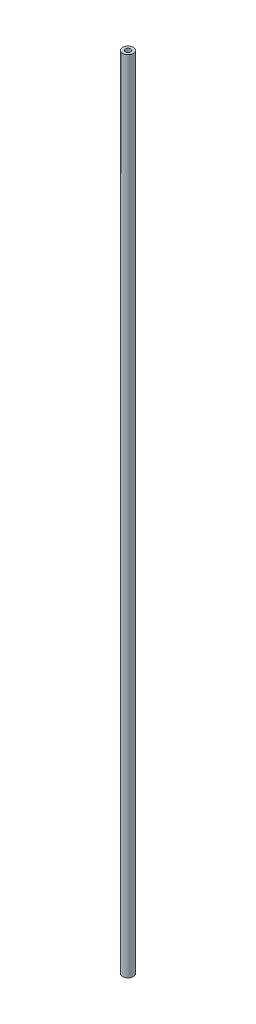
ISO-10303-21;
HEADER;
FILE_DESCRIPTION(('STEP AP214'),'2;1');
FILE_NAME('part.step','',(''),(''),'','','');
FILE_SCHEMA(('AUTOMOTIVE_DESIGN { 1 0 10303 214 1 1 1 1 }'));
ENDSEC;
DATA;
#1=APPLICATION_CONTEXT('core data for automotive mechanical design processes');
#2=APPLICATION_PROTOCOL_DEFINITION('international standard','automotive_design',2000,#1);
#3=PRODUCT_CONTEXT('',#1,'mechanical');
#4=PRODUCT('Part','Part','',(#3));
#5=PRODUCT_RELATED_PRODUCT_CATEGORY('part','',(#4));
#6=PRODUCT_DEFINITION_FORMATION('','',#4);
#7=PRODUCT_DEFINITION_CONTEXT('part definition',#1,'design');
#8=PRODUCT_DEFINITION('design','',#6,#7);
#9=PRODUCT_DEFINITION_SHAPE('','',#8);
#10=(LENGTH_UNIT() NAMED_UNIT(*) SI_UNIT(.MILLI.,.METRE.));
#11=(NAMED_UNIT(*) PLANE_ANGLE_UNIT() SI_UNIT($,.RADIAN.));
#12=(NAMED_UNIT(*) SI_UNIT($,.STERADIAN.) SOLID_ANGLE_UNIT());
#13=UNCERTAINTY_MEASURE_WITH_UNIT(LENGTH_MEASURE(1.E-05),#10,'distance_accuracy_value','');
#14=(GEOMETRIC_REPRESENTATION_CONTEXT(3) GLOBAL_UNCERTAINTY_ASSIGNED_CONTEXT((#13)) GLOBAL_UNIT_ASSIGNED_CONTEXT((#10,
#11,#12)) REPRESENTATION_CONTEXT('',''));
#15=CARTESIAN_POINT('',(0.,0.,0.));
#16=DIRECTION('',(0.,0.,1.));
#17=DIRECTION('',(1.,0.,0.));
#18=AXIS2_PLACEMENT_3D('',#15,#16,#17);
#19=CARTESIAN_POINT('',(0.,150.,0.));
#20=DIRECTION('',(0.,1.,0.));
#21=DIRECTION('',(0.,0.,1.));
#22=AXIS2_PLACEMENT_3D('',#19,#20,#21);
#23=PLANE('',#22);
#24=CARTESIAN_POINT('',(0.,150.,0.));
#25=DIRECTION('',(0.,1.,0.));
#26=DIRECTION('',(0.,0.,1.));
#27=AXIS2_PLACEMENT_3D('',#24,#25,#26);
#28=CIRCLE('',#27,1.);
#29=CARTESIAN_POINT('',(0.,150.,1.));
#30=VERTEX_POINT('',#29);
#31=EDGE_CURVE('E10',#30,#30,#28,.T.);
#32=ORIENTED_EDGE('',*,*,#31,.T.);
#33=EDGE_LOOP('',(#32));
#34=FACE_BOUND('',#33,.T.);
#35=CARTESIAN_POINT('',(0.,150.,0.));
#36=DIRECTION('',(0.,1.,0.));
#37=DIRECTION('',(0.,0.,1.));
#38=AXIS2_PLACEMENT_3D('',#35,#36,#37);
#39=CIRCLE('',#38,0.5);
#40=CARTESIAN_POINT('',(0.,150.,0.5));
#41=VERTEX_POINT('',#40);
#42=EDGE_CURVE('E56',#41,#41,#39,.T.);
#43=ORIENTED_EDGE('',*,*,#42,.F.);
#44=EDGE_LOOP('',(#43));
#45=FACE_BOUND('',#44,.T.);
#46=ADVANCED_FACE('F43',(#34,#45),#23,.T.);
#47=CARTESIAN_POINT('',(0.,0.,0.));
#48=DIRECTION('',(0.,1.,0.));
#49=DIRECTION('',(0.,0.,1.));
#50=AXIS2_PLACEMENT_3D('',#47,#48,#49);
#51=PLANE('',#50);
#52=CARTESIAN_POINT('',(0.,0.,0.));
#53=DIRECTION('',(0.,1.,0.));
#54=DIRECTION('',(0.,0.,1.));
#55=AXIS2_PLACEMENT_3D('',#52,#53,#54);
#56=CIRCLE('',#55,1.);
#57=CARTESIAN_POINT('',(0.,0.,1.));
#58=VERTEX_POINT('',#57);
#59=EDGE_CURVE('E47',#58,#58,#56,.T.);
#60=ORIENTED_EDGE('',*,*,#59,.F.);
#61=EDGE_LOOP('',(#60));
#62=FACE_BOUND('',#61,.T.);
#63=CARTESIAN_POINT('',(0.,0.,0.));
#64=DIRECTION('',(0.,1.,0.));
#65=DIRECTION('',(0.,0.,1.));
#66=AXIS2_PLACEMENT_3D('',#63,#64,#65);
#67=CIRCLE('',#66,0.5);
#68=CARTESIAN_POINT('',(0.,0.,0.5));
#69=VERTEX_POINT('',#68);
#70=EDGE_CURVE('E58',#69,#69,#67,.T.);
#71=ORIENTED_EDGE('',*,*,#70,.T.);
#72=EDGE_LOOP('',(#71));
#73=FACE_BOUND('',#72,.T.);
#74=ADVANCED_FACE('F70',(#62,#73),#51,.F.);
#75=CARTESIAN_POINT('',(0.,150.,0.));
#76=DIRECTION('',(0.,-1.,0.));
#77=DIRECTION('',(0.,0.,-1.));
#78=AXIS2_PLACEMENT_3D('',#75,#76,#77);
#79=CYLINDRICAL_SURFACE('',#78,1.);
#80=ORIENTED_EDGE('',*,*,#31,.F.);
#81=EDGE_LOOP('',(#80));
#82=FACE_BOUND('',#81,.T.);
#83=ORIENTED_EDGE('',*,*,#59,.T.);
#84=EDGE_LOOP('',(#83));
#85=FACE_BOUND('',#84,.T.);
#86=ADVANCED_FACE('F45',(#82,#85),#79,.T.);
#87=CARTESIAN_POINT('',(0.,150.,0.));
#88=DIRECTION('',(0.,-1.,0.));
#89=DIRECTION('',(0.,0.,-1.));
#90=AXIS2_PLACEMENT_3D('',#87,#88,#89);
#91=CYLINDRICAL_SURFACE('',#90,0.5);
#92=ORIENTED_EDGE('',*,*,#42,.T.);
#93=EDGE_LOOP('',(#92));
#94=FACE_BOUND('',#93,.T.);
#95=ORIENTED_EDGE('',*,*,#70,.F.);
#96=EDGE_LOOP('',(#95));
#97=FACE_BOUND('',#96,.T.);
#98=ADVANCED_FACE('F66',(#94,#97),#91,.F.);
#99=CLOSED_SHELL('',(#46,#74,#86,#98));
#100=MANIFOLD_SOLID_BREP('B2',#99);
#101=ADVANCED_BREP_SHAPE_REPRESENTATION('',(#18,#100),#14);
#102=SHAPE_DEFINITION_REPRESENTATION(#9,#101);
ENDSEC;
END-ISO-10303-21;
